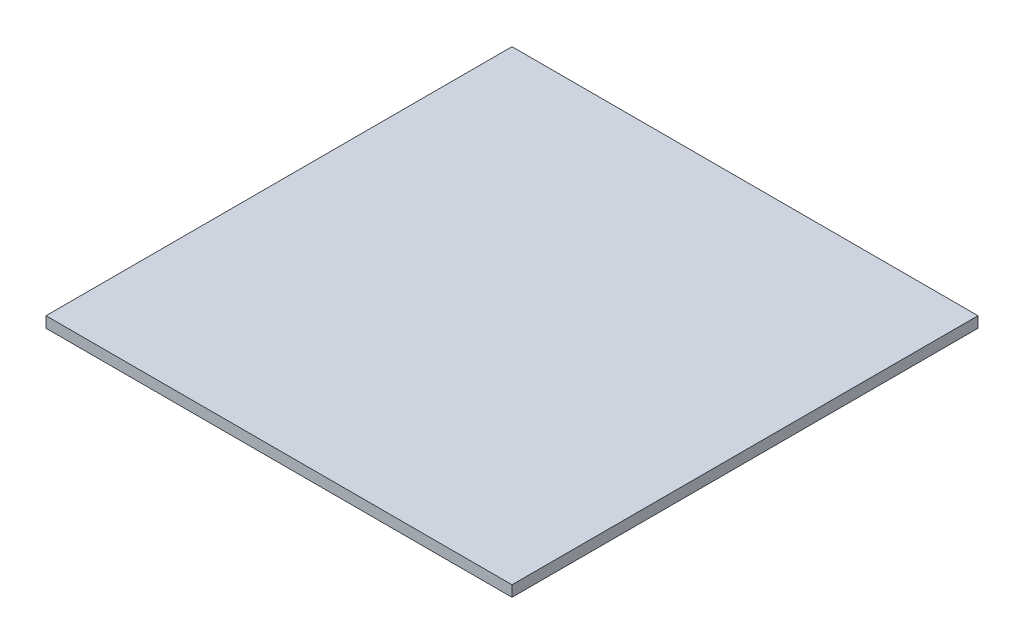
ISO-10303-21;
HEADER;
FILE_DESCRIPTION(('STEP AP214'),'2;1');
FILE_NAME('part.step','',(''),(''),'','','');
FILE_SCHEMA(('AUTOMOTIVE_DESIGN { 1 0 10303 214 1 1 1 1 }'));
ENDSEC;
DATA;
#1=APPLICATION_CONTEXT('core data for automotive mechanical design processes');
#2=APPLICATION_PROTOCOL_DEFINITION('international standard','automotive_design',2000,#1);
#3=PRODUCT_CONTEXT('',#1,'mechanical');
#4=PRODUCT('Part','Part','',(#3));
#5=PRODUCT_RELATED_PRODUCT_CATEGORY('part','',(#4));
#6=PRODUCT_DEFINITION_FORMATION('','',#4);
#7=PRODUCT_DEFINITION_CONTEXT('part definition',#1,'design');
#8=PRODUCT_DEFINITION('design','',#6,#7);
#9=PRODUCT_DEFINITION_SHAPE('','',#8);
#10=(LENGTH_UNIT() NAMED_UNIT(*) SI_UNIT(.MILLI.,.METRE.));
#11=(NAMED_UNIT(*) PLANE_ANGLE_UNIT() SI_UNIT($,.RADIAN.));
#12=(NAMED_UNIT(*) SI_UNIT($,.STERADIAN.) SOLID_ANGLE_UNIT());
#13=UNCERTAINTY_MEASURE_WITH_UNIT(LENGTH_MEASURE(1.E-05),#10,'distance_accuracy_value','');
#14=(GEOMETRIC_REPRESENTATION_CONTEXT(3) GLOBAL_UNCERTAINTY_ASSIGNED_CONTEXT((#13)) GLOBAL_UNIT_ASSIGNED_CONTEXT((#10,
#11,#12)) REPRESENTATION_CONTEXT('',''));
#15=CARTESIAN_POINT('',(0.,0.,0.));
#16=DIRECTION('',(0.,0.,1.));
#17=DIRECTION('',(1.,0.,0.));
#18=AXIS2_PLACEMENT_3D('',#15,#16,#17);
#19=CARTESIAN_POINT('',(107.,5.,107.));
#20=DIRECTION('',(0.,0.,-1.));
#21=DIRECTION('',(-1.,0.,0.));
#22=AXIS2_PLACEMENT_3D('',#19,#20,#21);
#23=PLANE('',#22);
#24=DIRECTION('',(1.,0.,0.));
#25=VECTOR('',#24,1.);
#26=CARTESIAN_POINT('',(107.,0.,107.));
#27=LINE('',#26,#25);
#28=CARTESIAN_POINT('',(-107.,0.,107.));
#29=VERTEX_POINT('',#28);
#30=CARTESIAN_POINT('',(107.,0.,107.));
#31=VERTEX_POINT('',#30);
#32=EDGE_CURVE('E86',#29,#31,#27,.T.);
#33=ORIENTED_EDGE('',*,*,#32,.T.);
#34=DIRECTION('',(0.,-1.,0.));
#35=VECTOR('',#34,1.);
#36=CARTESIAN_POINT('',(107.,5.,107.));
#37=LINE('',#36,#35);
#38=CARTESIAN_POINT('',(107.,5.,107.));
#39=VERTEX_POINT('',#38);
#40=EDGE_CURVE('E40',#39,#31,#37,.T.);
#41=ORIENTED_EDGE('',*,*,#40,.F.);
#42=DIRECTION('',(1.,0.,0.));
#43=VECTOR('',#42,1.);
#44=CARTESIAN_POINT('',(107.,5.,107.));
#45=LINE('',#44,#43);
#46=CARTESIAN_POINT('',(-107.,5.,107.));
#47=VERTEX_POINT('',#46);
#48=EDGE_CURVE('E79',#47,#39,#45,.T.);
#49=ORIENTED_EDGE('',*,*,#48,.F.);
#50=DIRECTION('',(0.,-1.,0.));
#51=VECTOR('',#50,1.);
#52=CARTESIAN_POINT('',(-107.,5.,107.));
#53=LINE('',#52,#51);
#54=EDGE_CURVE('E11',#47,#29,#53,.T.);
#55=ORIENTED_EDGE('',*,*,#54,.T.);
#56=EDGE_LOOP('',(#33,#41,#49,#55));
#57=FACE_BOUND('',#56,.T.);
#58=ADVANCED_FACE('F32',(#57),#23,.F.);
#59=CARTESIAN_POINT('',(107.,5.,-107.));
#60=DIRECTION('',(-1.,0.,0.));
#61=DIRECTION('',(0.,0.,1.));
#62=AXIS2_PLACEMENT_3D('',#59,#60,#61);
#63=PLANE('',#62);
#64=DIRECTION('',(0.,0.,-1.));
#65=VECTOR('',#64,1.);
#66=CARTESIAN_POINT('',(107.,0.,-107.));
#67=LINE('',#66,#65);
#68=CARTESIAN_POINT('',(107.,0.,-107.));
#69=VERTEX_POINT('',#68);
#70=EDGE_CURVE('E66',#31,#69,#67,.T.);
#71=ORIENTED_EDGE('',*,*,#70,.T.);
#72=DIRECTION('',(0.,-1.,0.));
#73=VECTOR('',#72,1.);
#74=CARTESIAN_POINT('',(107.,5.,-107.));
#75=LINE('',#74,#73);
#76=CARTESIAN_POINT('',(107.,5.,-107.));
#77=VERTEX_POINT('',#76);
#78=EDGE_CURVE('E87',#77,#69,#75,.T.);
#79=ORIENTED_EDGE('',*,*,#78,.F.);
#80=DIRECTION('',(0.,0.,-1.));
#81=VECTOR('',#80,1.);
#82=CARTESIAN_POINT('',(107.,5.,-107.));
#83=LINE('',#82,#81);
#84=EDGE_CURVE('E83',#39,#77,#83,.T.);
#85=ORIENTED_EDGE('',*,*,#84,.F.);
#86=ORIENTED_EDGE('',*,*,#40,.T.);
#87=EDGE_LOOP('',(#71,#79,#85,#86));
#88=FACE_BOUND('',#87,.T.);
#89=ADVANCED_FACE('F88',(#88),#63,.F.);
#90=CARTESIAN_POINT('',(-107.,5.,-107.));
#91=DIRECTION('',(0.,0.,1.));
#92=DIRECTION('',(1.,0.,0.));
#93=AXIS2_PLACEMENT_3D('',#90,#91,#92);
#94=PLANE('',#93);
#95=DIRECTION('',(-1.,0.,0.));
#96=VECTOR('',#95,1.);
#97=CARTESIAN_POINT('',(-107.,0.,-107.));
#98=LINE('',#97,#96);
#99=CARTESIAN_POINT('',(-107.,0.,-107.));
#100=VERTEX_POINT('',#99);
#101=EDGE_CURVE('E73',#69,#100,#98,.T.);
#102=ORIENTED_EDGE('',*,*,#101,.T.);
#103=DIRECTION('',(0.,-1.,0.));
#104=VECTOR('',#103,1.);
#105=CARTESIAN_POINT('',(-107.,5.,-107.));
#106=LINE('',#105,#104);
#107=CARTESIAN_POINT('',(-107.,5.,-107.));
#108=VERTEX_POINT('',#107);
#109=EDGE_CURVE('E92',#108,#100,#106,.T.);
#110=ORIENTED_EDGE('',*,*,#109,.F.);
#111=DIRECTION('',(-1.,0.,0.));
#112=VECTOR('',#111,1.);
#113=CARTESIAN_POINT('',(-107.,5.,-107.));
#114=LINE('',#113,#112);
#115=EDGE_CURVE('E90',#77,#108,#114,.T.);
#116=ORIENTED_EDGE('',*,*,#115,.F.);
#117=ORIENTED_EDGE('',*,*,#78,.T.);
#118=EDGE_LOOP('',(#102,#110,#116,#117));
#119=FACE_BOUND('',#118,.T.);
#120=ADVANCED_FACE('F102',(#119),#94,.F.);
#121=CARTESIAN_POINT('',(-107.,5.,0.));
#122=DIRECTION('',(1.,0.,0.));
#123=DIRECTION('',(0.,0.,-1.));
#124=AXIS2_PLACEMENT_3D('',#121,#122,#123);
#125=PLANE('',#124);
#126=DIRECTION('',(0.,0.,1.));
#127=VECTOR('',#126,1.);
#128=CARTESIAN_POINT('',(-107.,0.,0.));
#129=LINE('',#128,#127);
#130=EDGE_CURVE('E99',#100,#29,#129,.T.);
#131=ORIENTED_EDGE('',*,*,#130,.T.);
#132=ORIENTED_EDGE('',*,*,#54,.F.);
#133=DIRECTION('',(0.,0.,1.));
#134=VECTOR('',#133,1.);
#135=CARTESIAN_POINT('',(-107.,5.,107.));
#136=LINE('',#135,#134);
#137=EDGE_CURVE('E48',#108,#47,#136,.T.);
#138=ORIENTED_EDGE('',*,*,#137,.F.);
#139=ORIENTED_EDGE('',*,*,#109,.T.);
#140=EDGE_LOOP('',(#131,#132,#138,#139));
#141=FACE_BOUND('',#140,.T.);
#142=ADVANCED_FACE('F106',(#141),#125,.F.);
#143=CARTESIAN_POINT('',(0.,5.,0.));
#144=DIRECTION('',(0.,-1.,0.));
#145=DIRECTION('',(0.,0.,-1.));
#146=AXIS2_PLACEMENT_3D('',#143,#144,#145);
#147=PLANE('',#146);
#148=ORIENTED_EDGE('',*,*,#137,.T.);
#149=ORIENTED_EDGE('',*,*,#48,.T.);
#150=ORIENTED_EDGE('',*,*,#84,.T.);
#151=ORIENTED_EDGE('',*,*,#115,.T.);
#152=EDGE_LOOP('',(#148,#149,#150,#151));
#153=FACE_BOUND('',#152,.T.);
#154=ADVANCED_FACE('F81',(#153),#147,.F.);
#155=CARTESIAN_POINT('',(0.,0.,0.));
#156=DIRECTION('',(0.,-1.,0.));
#157=DIRECTION('',(0.,0.,-1.));
#158=AXIS2_PLACEMENT_3D('',#155,#156,#157);
#159=PLANE('',#158);
#160=ORIENTED_EDGE('',*,*,#32,.F.);
#161=ORIENTED_EDGE('',*,*,#130,.F.);
#162=ORIENTED_EDGE('',*,*,#101,.F.);
#163=ORIENTED_EDGE('',*,*,#70,.F.);
#164=EDGE_LOOP('',(#160,#161,#162,#163));
#165=FACE_BOUND('',#164,.T.);
#166=ADVANCED_FACE('F105',(#165),#159,.T.);
#167=CLOSED_SHELL('',(#58,#89,#120,#142,#154,#166));
#168=MANIFOLD_SOLID_BREP('B2',#167);
#169=ADVANCED_BREP_SHAPE_REPRESENTATION('',(#18,#168),#14);
#170=SHAPE_DEFINITION_REPRESENTATION(#9,#169);
ENDSEC;
END-ISO-10303-21;
